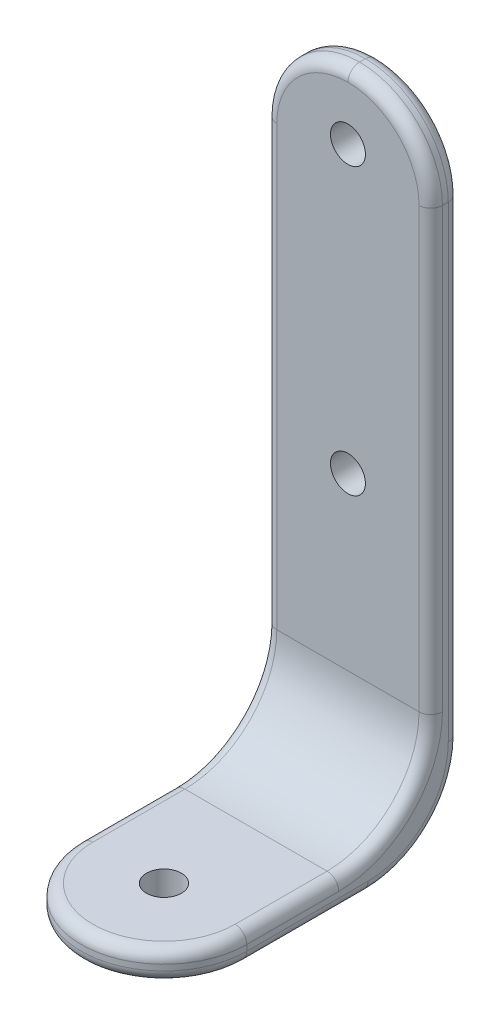
ISO-10303-21;
HEADER;
FILE_DESCRIPTION(('STEP AP214'),'2;1');
FILE_NAME('part.step','',(''),(''),'','','');
FILE_SCHEMA(('AUTOMOTIVE_DESIGN { 1 0 10303 214 1 1 1 1 }'));
ENDSEC;
DATA;
#1=APPLICATION_CONTEXT('core data for automotive mechanical design processes');
#2=APPLICATION_PROTOCOL_DEFINITION('international standard','automotive_design',2000,#1);
#3=PRODUCT_CONTEXT('',#1,'mechanical');
#4=PRODUCT('Part','Part','',(#3));
#5=PRODUCT_RELATED_PRODUCT_CATEGORY('part','',(#4));
#6=PRODUCT_DEFINITION_FORMATION('','',#4);
#7=PRODUCT_DEFINITION_CONTEXT('part definition',#1,'design');
#8=PRODUCT_DEFINITION('design','',#6,#7);
#9=PRODUCT_DEFINITION_SHAPE('','',#8);
#10=(LENGTH_UNIT() NAMED_UNIT(*) SI_UNIT(.MILLI.,.METRE.));
#11=(NAMED_UNIT(*) PLANE_ANGLE_UNIT() SI_UNIT($,.RADIAN.));
#12=(NAMED_UNIT(*) SI_UNIT($,.STERADIAN.) SOLID_ANGLE_UNIT());
#13=UNCERTAINTY_MEASURE_WITH_UNIT(LENGTH_MEASURE(1.E-05),#10,'distance_accuracy_value','');
#14=(GEOMETRIC_REPRESENTATION_CONTEXT(3) GLOBAL_UNCERTAINTY_ASSIGNED_CONTEXT((#13)) GLOBAL_UNIT_ASSIGNED_CONTEXT((#10,
#11,#12)) REPRESENTATION_CONTEXT('',''));
#15=CARTESIAN_POINT('',(0.,0.,0.));
#16=DIRECTION('',(0.,0.,1.));
#17=DIRECTION('',(1.,0.,0.));
#18=AXIS2_PLACEMENT_3D('',#15,#16,#17);
#19=CARTESIAN_POINT('',(-9.,-3.175,-7.08750000000001));
#20=DIRECTION('',(1.,0.,0.));
#21=DIRECTION('',(0.,0.,-1.));
#22=AXIS2_PLACEMENT_3D('',#19,#20,#21);
#23=PLANE('',#22);
#24=CARTESIAN_POINT('',(-9.,6.825,-13.175));
#25=DIRECTION('',(1.,0.,0.));
#26=DIRECTION('',(0.,0.,-1.));
#27=AXIS2_PLACEMENT_3D('',#24,#25,#26);
#28=CIRCLE('',#27,8.73);
#29=CARTESIAN_POINT('',(-9.,6.825,-21.905));
#30=VERTEX_POINT('',#29);
#31=CARTESIAN_POINT('',(-9.,-1.905,-13.175));
#32=VERTEX_POINT('',#31);
#33=EDGE_CURVE('E277',#30,#32,#28,.F.);
#34=ORIENTED_EDGE('',*,*,#33,.T.);
#35=DIRECTION('',(0.,0.,-1.));
#36=VECTOR('',#35,1.);
#37=CARTESIAN_POINT('',(-9.,-1.905,-7.08750000000001));
#38=LINE('',#37,#36);
#39=CARTESIAN_POINT('',(-9.,-1.905,0.));
#40=VERTEX_POINT('',#39);
#41=EDGE_CURVE('E275',#32,#40,#38,.F.);
#42=ORIENTED_EDGE('',*,*,#41,.T.);
#43=DIRECTION('',(0.,1.,0.));
#44=VECTOR('',#43,1.);
#45=CARTESIAN_POINT('',(-9.,-3.175,0.));
#46=LINE('',#45,#44);
#47=CARTESIAN_POINT('',(-9.,-1.27,0.));
#48=VERTEX_POINT('',#47);
#49=EDGE_CURVE('E325',#40,#48,#46,.T.);
#50=ORIENTED_EDGE('',*,*,#49,.T.);
#51=DIRECTION('',(0.,0.,-1.));
#52=VECTOR('',#51,1.);
#53=CARTESIAN_POINT('',(-9.,-1.27,-10.));
#54=LINE('',#53,#52);
#55=CARTESIAN_POINT('',(-9.,-1.27,-10.));
#56=VERTEX_POINT('',#55);
#57=EDGE_CURVE('E285',#48,#56,#54,.T.);
#58=ORIENTED_EDGE('',*,*,#57,.T.);
#59=CARTESIAN_POINT('',(-9.,10.,-10.));
#60=DIRECTION('',(1.,0.,0.));
#61=DIRECTION('',(0.,0.,-1.));
#62=AXIS2_PLACEMENT_3D('',#59,#60,#61);
#63=CIRCLE('',#62,11.27);
#64=CARTESIAN_POINT('',(-9.,10.,-21.27));
#65=VERTEX_POINT('',#64);
#66=EDGE_CURVE('E283',#56,#65,#63,.T.);
#67=ORIENTED_EDGE('',*,*,#66,.T.);
#68=DIRECTION('',(0.,-1.,0.));
#69=VECTOR('',#68,1.);
#70=CARTESIAN_POINT('',(-9.,-3.175,-21.27));
#71=LINE('',#70,#69);
#72=CARTESIAN_POINT('',(-9.,57.675,-21.27));
#73=VERTEX_POINT('',#72);
#74=EDGE_CURVE('E281',#65,#73,#71,.F.);
#75=ORIENTED_EDGE('',*,*,#74,.T.);
#76=DIRECTION('',(0.,0.,-1.));
#77=VECTOR('',#76,1.);
#78=CARTESIAN_POINT('',(-9.,57.675,-23.175));
#79=LINE('',#78,#77);
#80=CARTESIAN_POINT('',(-9.,57.675,-21.905));
#81=VERTEX_POINT('',#80);
#82=EDGE_CURVE('E180',#73,#81,#79,.T.);
#83=ORIENTED_EDGE('',*,*,#82,.T.);
#84=DIRECTION('',(0.,1.,0.));
#85=VECTOR('',#84,1.);
#86=CARTESIAN_POINT('',(-9.,-3.175,-21.905));
#87=LINE('',#86,#85);
#88=EDGE_CURVE('E279',#81,#30,#87,.F.);
#89=ORIENTED_EDGE('',*,*,#88,.T.);
#90=EDGE_LOOP('',(#34,#42,#50,#58,#67,#75,#83,#89));
#91=FACE_BOUND('',#90,.T.);
#92=ADVANCED_FACE('F34',(#91),#23,.F.);
#93=CARTESIAN_POINT('',(-28.8177971405829,-3.175,-23.175));
#94=DIRECTION('',(0.,0.,1.));
#95=DIRECTION('',(1.,0.,0.));
#96=AXIS2_PLACEMENT_3D('',#93,#94,#95);
#97=PLANE('',#96);
#98=CARTESIAN_POINT('',(0.,59.575,-23.175));
#99=DIRECTION('',(0.,0.,1.));
#100=DIRECTION('',(1.,0.,0.));
#101=AXIS2_PLACEMENT_3D('',#98,#99,#100);
#102=CIRCLE('',#101,1.89865);
#103=CARTESIAN_POINT('',(1.89865,59.575,-23.175));
#104=VERTEX_POINT('',#103);
#105=EDGE_CURVE('E342',#104,#104,#102,.T.);
#106=ORIENTED_EDGE('',*,*,#105,.T.);
#107=EDGE_LOOP('',(#106));
#108=FACE_BOUND('',#107,.T.);
#109=CARTESIAN_POINT('',(0.,28.575,-23.175));
#110=DIRECTION('',(0.,0.,1.));
#111=DIRECTION('',(1.,0.,0.));
#112=AXIS2_PLACEMENT_3D('',#109,#110,#111);
#113=CIRCLE('',#112,1.89865);
#114=CARTESIAN_POINT('',(1.89865,28.575,-23.175));
#115=VERTEX_POINT('',#114);
#116=EDGE_CURVE('E336',#115,#115,#113,.T.);
#117=ORIENTED_EDGE('',*,*,#116,.T.);
#118=EDGE_LOOP('',(#117));
#119=FACE_BOUND('',#118,.T.);
#120=DIRECTION('',(1.,0.,0.));
#121=VECTOR('',#120,1.);
#122=CARTESIAN_POINT('',(-28.8177971405829,6.825,-23.175));
#123=LINE('',#122,#121);
#124=CARTESIAN_POINT('',(7.73,6.825,-23.175));
#125=VERTEX_POINT('',#124);
#126=CARTESIAN_POINT('',(-7.73,6.825,-23.175));
#127=VERTEX_POINT('',#126);
#128=EDGE_CURVE('E310',#125,#127,#123,.F.);
#129=ORIENTED_EDGE('',*,*,#128,.T.);
#130=DIRECTION('',(0.,1.,0.));
#131=VECTOR('',#130,1.);
#132=CARTESIAN_POINT('',(-7.73,-3.175,-23.175));
#133=LINE('',#132,#131);
#134=CARTESIAN_POINT('',(-7.73,57.675,-23.175));
#135=VERTEX_POINT('',#134);
#136=EDGE_CURVE('E268',#127,#135,#133,.T.);
#137=ORIENTED_EDGE('',*,*,#136,.T.);
#138=CARTESIAN_POINT('',(0.,57.675,-23.175));
#139=DIRECTION('',(0.,0.,1.));
#140=DIRECTION('',(1.,0.,0.));
#141=AXIS2_PLACEMENT_3D('',#138,#139,#140);
#142=CIRCLE('',#141,7.73);
#143=CARTESIAN_POINT('',(0.,65.405,-23.175));
#144=VERTEX_POINT('',#143);
#145=EDGE_CURVE('E270',#135,#144,#142,.F.);
#146=ORIENTED_EDGE('',*,*,#145,.T.);
#147=CARTESIAN_POINT('',(0.,57.675,-23.175));
#148=DIRECTION('',(0.,0.,1.));
#149=DIRECTION('',(1.,0.,0.));
#150=AXIS2_PLACEMENT_3D('',#147,#148,#149);
#151=CIRCLE('',#150,7.73);
#152=CARTESIAN_POINT('',(7.73,57.675,-23.175));
#153=VERTEX_POINT('',#152);
#154=EDGE_CURVE('E272',#144,#153,#151,.F.);
#155=ORIENTED_EDGE('',*,*,#154,.T.);
#156=DIRECTION('',(0.,1.,0.));
#157=VECTOR('',#156,1.);
#158=CARTESIAN_POINT('',(7.73,6.825,-23.175));
#159=LINE('',#158,#157);
#160=EDGE_CURVE('E194',#153,#125,#159,.F.);
#161=ORIENTED_EDGE('',*,*,#160,.T.);
#162=EDGE_LOOP('',(#129,#137,#146,#155,#161));
#163=FACE_BOUND('',#162,.T.);
#164=ADVANCED_FACE('F423',(#108,#119,#163),#97,.F.);
#165=CARTESIAN_POINT('',(9.,-3.175,-7.08750000000001));
#166=DIRECTION('',(1.,0.,0.));
#167=DIRECTION('',(0.,0.,-1.));
#168=AXIS2_PLACEMENT_3D('',#165,#166,#167);
#169=PLANE('',#168);
#170=DIRECTION('',(0.,1.,0.));
#171=VECTOR('',#170,1.);
#172=CARTESIAN_POINT('',(9.,-3.175,0.));
#173=LINE('',#172,#171);
#174=CARTESIAN_POINT('',(9.,-1.905,0.));
#175=VERTEX_POINT('',#174);
#176=CARTESIAN_POINT('',(9.,-1.27,0.));
#177=VERTEX_POINT('',#176);
#178=EDGE_CURVE('E324',#175,#177,#173,.T.);
#179=ORIENTED_EDGE('',*,*,#178,.F.);
#180=DIRECTION('',(0.,0.,-1.));
#181=VECTOR('',#180,1.);
#182=CARTESIAN_POINT('',(9.,-1.905,-13.175));
#183=LINE('',#182,#181);
#184=CARTESIAN_POINT('',(9.,-1.905,-13.175));
#185=VERTEX_POINT('',#184);
#186=EDGE_CURVE('E302',#175,#185,#183,.T.);
#187=ORIENTED_EDGE('',*,*,#186,.T.);
#188=CARTESIAN_POINT('',(9.,6.825,-13.175));
#189=DIRECTION('',(1.,0.,0.));
#190=DIRECTION('',(0.,0.,-1.));
#191=AXIS2_PLACEMENT_3D('',#188,#189,#190);
#192=CIRCLE('',#191,8.73);
#193=CARTESIAN_POINT('',(9.,6.825,-21.905));
#194=VERTEX_POINT('',#193);
#195=EDGE_CURVE('E164',#185,#194,#192,.T.);
#196=ORIENTED_EDGE('',*,*,#195,.T.);
#197=DIRECTION('',(0.,1.,0.));
#198=VECTOR('',#197,1.);
#199=CARTESIAN_POINT('',(9.,57.675,-21.905));
#200=LINE('',#199,#198);
#201=CARTESIAN_POINT('',(9.,57.675,-21.905));
#202=VERTEX_POINT('',#201);
#203=EDGE_CURVE('E158',#194,#202,#200,.T.);
#204=ORIENTED_EDGE('',*,*,#203,.T.);
#205=DIRECTION('',(0.,0.,1.));
#206=VECTOR('',#205,1.);
#207=CARTESIAN_POINT('',(9.,57.675,-7.08750000000001));
#208=LINE('',#207,#206);
#209=CARTESIAN_POINT('',(9.,57.675,-21.27));
#210=VERTEX_POINT('',#209);
#211=EDGE_CURVE('E162',#202,#210,#208,.T.);
#212=ORIENTED_EDGE('',*,*,#211,.T.);
#213=DIRECTION('',(0.,-1.,0.));
#214=VECTOR('',#213,1.);
#215=CARTESIAN_POINT('',(9.,10.,-21.27));
#216=LINE('',#215,#214);
#217=CARTESIAN_POINT('',(9.,10.,-21.27));
#218=VERTEX_POINT('',#217);
#219=EDGE_CURVE('E308',#210,#218,#216,.T.);
#220=ORIENTED_EDGE('',*,*,#219,.T.);
#221=CARTESIAN_POINT('',(9.,10.,-10.));
#222=DIRECTION('',(1.,0.,0.));
#223=DIRECTION('',(0.,0.,-1.));
#224=AXIS2_PLACEMENT_3D('',#221,#222,#223);
#225=CIRCLE('',#224,11.27);
#226=CARTESIAN_POINT('',(9.,-1.27,-10.));
#227=VERTEX_POINT('',#226);
#228=EDGE_CURVE('E306',#218,#227,#225,.F.);
#229=ORIENTED_EDGE('',*,*,#228,.T.);
#230=DIRECTION('',(0.,0.,-1.));
#231=VECTOR('',#230,1.);
#232=CARTESIAN_POINT('',(9.,-1.27,-7.08750000000001));
#233=LINE('',#232,#231);
#234=EDGE_CURVE('E168',#227,#177,#233,.F.);
#235=ORIENTED_EDGE('',*,*,#234,.T.);
#236=EDGE_LOOP('',(#179,#187,#196,#204,#212,#220,#229,#235));
#237=FACE_BOUND('',#236,.T.);
#238=ADVANCED_FACE('F161',(#237),#169,.T.);
#239=CARTESIAN_POINT('',(0.,-3.175,0.));
#240=DIRECTION('',(0.,1.,0.));
#241=DIRECTION('',(0.,0.,1.));
#242=AXIS2_PLACEMENT_3D('',#239,#240,#241);
#243=CYLINDRICAL_SURFACE('',#242,9.);
#244=ORIENTED_EDGE('',*,*,#49,.F.);
#245=CARTESIAN_POINT('',(0.,-1.905,0.));
#246=DIRECTION('',(0.,1.,0.));
#247=DIRECTION('',(0.,0.,1.));
#248=AXIS2_PLACEMENT_3D('',#245,#246,#247);
#249=CIRCLE('',#248,9.);
#250=EDGE_CURVE('E287',#40,#175,#249,.T.);
#251=ORIENTED_EDGE('',*,*,#250,.T.);
#252=ORIENTED_EDGE('',*,*,#178,.T.);
#253=CARTESIAN_POINT('',(0.,-1.27,0.));
#254=DIRECTION('',(0.,1.,0.));
#255=DIRECTION('',(0.,0.,1.));
#256=AXIS2_PLACEMENT_3D('',#253,#254,#255);
#257=CIRCLE('',#256,9.);
#258=EDGE_CURVE('E289',#177,#48,#257,.F.);
#259=ORIENTED_EDGE('',*,*,#258,.T.);
#260=EDGE_LOOP('',(#244,#251,#252,#259));
#261=FACE_BOUND('',#260,.T.);
#262=ADVANCED_FACE('F393',(#261),#243,.T.);
#263=CARTESIAN_POINT('',(-28.8177971405829,-3.175,-7.08750000000001));
#264=DIRECTION('',(0.,1.,0.));
#265=DIRECTION('',(0.,0.,1.));
#266=AXIS2_PLACEMENT_3D('',#263,#264,#265);
#267=PLANE('',#266);
#268=CARTESIAN_POINT('',(0.,-3.175,0.));
#269=DIRECTION('',(0.,1.,0.));
#270=DIRECTION('',(0.,0.,1.));
#271=AXIS2_PLACEMENT_3D('',#268,#269,#270);
#272=CIRCLE('',#271,1.89865);
#273=CARTESIAN_POINT('',(0.,-3.175,1.89865));
#274=VERTEX_POINT('',#273);
#275=EDGE_CURVE('E328',#274,#274,#272,.T.);
#276=ORIENTED_EDGE('',*,*,#275,.T.);
#277=EDGE_LOOP('',(#276));
#278=FACE_BOUND('',#277,.T.);
#279=DIRECTION('',(1.,0.,0.));
#280=VECTOR('',#279,1.);
#281=CARTESIAN_POINT('',(-28.8177971405829,-3.175,-13.175));
#282=LINE('',#281,#280);
#283=CARTESIAN_POINT('',(-7.73,-3.175,-13.175));
#284=VERTEX_POINT('',#283);
#285=CARTESIAN_POINT('',(7.73,-3.175,-13.175));
#286=VERTEX_POINT('',#285);
#287=EDGE_CURVE('E179',#284,#286,#282,.T.);
#288=ORIENTED_EDGE('',*,*,#287,.T.);
#289=DIRECTION('',(0.,0.,-1.));
#290=VECTOR('',#289,1.);
#291=CARTESIAN_POINT('',(7.73,-3.175,0.));
#292=LINE('',#291,#290);
#293=CARTESIAN_POINT('',(7.73,-3.175,0.));
#294=VERTEX_POINT('',#293);
#295=EDGE_CURVE('E291',#286,#294,#292,.F.);
#296=ORIENTED_EDGE('',*,*,#295,.T.);
#297=CARTESIAN_POINT('',(0.,-3.175,0.));
#298=DIRECTION('',(0.,1.,0.));
#299=DIRECTION('',(0.,0.,1.));
#300=AXIS2_PLACEMENT_3D('',#297,#298,#299);
#301=CIRCLE('',#300,7.73);
#302=CARTESIAN_POINT('',(-7.73,-3.175,0.));
#303=VERTEX_POINT('',#302);
#304=EDGE_CURVE('E293',#294,#303,#301,.F.);
#305=ORIENTED_EDGE('',*,*,#304,.T.);
#306=DIRECTION('',(0.,0.,-1.));
#307=VECTOR('',#306,1.);
#308=CARTESIAN_POINT('',(-7.73,-3.175,-7.08750000000001));
#309=LINE('',#308,#307);
#310=EDGE_CURVE('E295',#303,#284,#309,.T.);
#311=ORIENTED_EDGE('',*,*,#310,.T.);
#312=EDGE_LOOP('',(#288,#296,#305,#311));
#313=FACE_BOUND('',#312,.T.);
#314=ADVANCED_FACE('F675',(#278,#313),#267,.F.);
#315=CARTESIAN_POINT('',(-28.8177971405829,0.,-7.08750000000001));
#316=DIRECTION('',(0.,1.,0.));
#317=DIRECTION('',(0.,0.,1.));
#318=AXIS2_PLACEMENT_3D('',#315,#316,#317);
#319=PLANE('',#318);
#320=CARTESIAN_POINT('',(0.,0.,0.));
#321=DIRECTION('',(0.,1.,0.));
#322=DIRECTION('',(0.,0.,1.));
#323=AXIS2_PLACEMENT_3D('',#320,#321,#322);
#324=CIRCLE('',#323,1.89865);
#325=CARTESIAN_POINT('',(0.,0.,1.89865));
#326=VERTEX_POINT('',#325);
#327=EDGE_CURVE('E333',#326,#326,#324,.T.);
#328=ORIENTED_EDGE('',*,*,#327,.F.);
#329=EDGE_LOOP('',(#328));
#330=FACE_BOUND('',#329,.T.);
#331=DIRECTION('',(1.,0.,0.));
#332=VECTOR('',#331,1.);
#333=CARTESIAN_POINT('',(-28.8177971405829,0.,-10.));
#334=LINE('',#333,#332);
#335=CARTESIAN_POINT('',(7.73,0.,-10.));
#336=VERTEX_POINT('',#335);
#337=CARTESIAN_POINT('',(-7.73,0.,-10.));
#338=VERTEX_POINT('',#337);
#339=EDGE_CURVE('E319',#336,#338,#334,.F.);
#340=ORIENTED_EDGE('',*,*,#339,.T.);
#341=DIRECTION('',(0.,0.,-1.));
#342=VECTOR('',#341,1.);
#343=CARTESIAN_POINT('',(-7.73,0.,0.));
#344=LINE('',#343,#342);
#345=CARTESIAN_POINT('',(-7.73,0.,0.));
#346=VERTEX_POINT('',#345);
#347=EDGE_CURVE('E11',#338,#346,#344,.F.);
#348=ORIENTED_EDGE('',*,*,#347,.T.);
#349=CARTESIAN_POINT('',(0.,0.,0.));
#350=DIRECTION('',(0.,1.,0.));
#351=DIRECTION('',(0.,0.,1.));
#352=AXIS2_PLACEMENT_3D('',#349,#350,#351);
#353=CIRCLE('',#352,7.73);
#354=CARTESIAN_POINT('',(7.73,0.,0.));
#355=VERTEX_POINT('',#354);
#356=EDGE_CURVE('E43',#346,#355,#353,.T.);
#357=ORIENTED_EDGE('',*,*,#356,.T.);
#358=DIRECTION('',(0.,0.,-1.));
#359=VECTOR('',#358,1.);
#360=CARTESIAN_POINT('',(7.73,0.,-7.08750000000001));
#361=LINE('',#360,#359);
#362=EDGE_CURVE('E249',#355,#336,#361,.T.);
#363=ORIENTED_EDGE('',*,*,#362,.T.);
#364=EDGE_LOOP('',(#340,#348,#357,#363));
#365=FACE_BOUND('',#364,.T.);
#366=ADVANCED_FACE('F354',(#330,#365),#319,.T.);
#367=CARTESIAN_POINT('',(-28.8177971405829,66.675,-20.));
#368=DIRECTION('',(0.,0.,-1.));
#369=DIRECTION('',(-1.,0.,0.));
#370=AXIS2_PLACEMENT_3D('',#367,#368,#369);
#371=PLANE('',#370);
#372=CARTESIAN_POINT('',(0.,59.575,-20.));
#373=DIRECTION('',(0.,0.,1.));
#374=DIRECTION('',(1.,0.,0.));
#375=AXIS2_PLACEMENT_3D('',#372,#373,#374);
#376=CIRCLE('',#375,1.89865);
#377=CARTESIAN_POINT('',(1.89865,59.575,-20.));
#378=VERTEX_POINT('',#377);
#379=EDGE_CURVE('E315',#378,#378,#376,.T.);
#380=ORIENTED_EDGE('',*,*,#379,.F.);
#381=EDGE_LOOP('',(#380));
#382=FACE_BOUND('',#381,.T.);
#383=CARTESIAN_POINT('',(0.,28.575,-20.));
#384=DIRECTION('',(0.,0.,1.));
#385=DIRECTION('',(1.,0.,0.));
#386=AXIS2_PLACEMENT_3D('',#383,#384,#385);
#387=CIRCLE('',#386,1.89865);
#388=CARTESIAN_POINT('',(1.89865,28.575,-20.));
#389=VERTEX_POINT('',#388);
#390=EDGE_CURVE('E339',#389,#389,#387,.T.);
#391=ORIENTED_EDGE('',*,*,#390,.F.);
#392=EDGE_LOOP('',(#391));
#393=FACE_BOUND('',#392,.T.);
#394=CARTESIAN_POINT('',(0.,57.675,-20.));
#395=DIRECTION('',(0.,0.,-1.));
#396=DIRECTION('',(-1.,0.,0.));
#397=AXIS2_PLACEMENT_3D('',#394,#395,#396);
#398=CIRCLE('',#397,7.73);
#399=CARTESIAN_POINT('',(0.,65.405,-20.));
#400=VERTEX_POINT('',#399);
#401=CARTESIAN_POINT('',(-7.73,57.675,-20.));
#402=VERTEX_POINT('',#401);
#403=EDGE_CURVE('E257',#400,#402,#398,.F.);
#404=ORIENTED_EDGE('',*,*,#403,.T.);
#405=DIRECTION('',(0.,-1.,0.));
#406=VECTOR('',#405,1.);
#407=CARTESIAN_POINT('',(-7.73,66.675,-20.));
#408=LINE('',#407,#406);
#409=CARTESIAN_POINT('',(-7.73,10.,-20.));
#410=VERTEX_POINT('',#409);
#411=EDGE_CURVE('E255',#402,#410,#408,.T.);
#412=ORIENTED_EDGE('',*,*,#411,.T.);
#413=DIRECTION('',(1.,0.,0.));
#414=VECTOR('',#413,1.);
#415=CARTESIAN_POINT('',(-28.8177971405829,10.,-20.));
#416=LINE('',#415,#414);
#417=CARTESIAN_POINT('',(7.73,10.,-20.));
#418=VERTEX_POINT('',#417);
#419=EDGE_CURVE('E321',#410,#418,#416,.T.);
#420=ORIENTED_EDGE('',*,*,#419,.T.);
#421=DIRECTION('',(0.,-1.,0.));
#422=VECTOR('',#421,1.);
#423=CARTESIAN_POINT('',(7.73,57.675,-20.));
#424=LINE('',#423,#422);
#425=CARTESIAN_POINT('',(7.73,57.675,-20.));
#426=VERTEX_POINT('',#425);
#427=EDGE_CURVE('E191',#418,#426,#424,.F.);
#428=ORIENTED_EDGE('',*,*,#427,.T.);
#429=CARTESIAN_POINT('',(0.,57.675,-20.));
#430=DIRECTION('',(0.,0.,-1.));
#431=DIRECTION('',(-1.,0.,0.));
#432=AXIS2_PLACEMENT_3D('',#429,#430,#431);
#433=CIRCLE('',#432,7.73);
#434=EDGE_CURVE('E259',#426,#400,#433,.F.);
#435=ORIENTED_EDGE('',*,*,#434,.T.);
#436=EDGE_LOOP('',(#404,#412,#420,#428,#435));
#437=FACE_BOUND('',#436,.T.);
#438=ADVANCED_FACE('F350',(#382,#393,#437),#371,.F.);
#439=CARTESIAN_POINT('',(0.,0.,0.));
#440=DIRECTION('',(0.,1.,0.));
#441=DIRECTION('',(0.,0.,1.));
#442=AXIS2_PLACEMENT_3D('',#439,#440,#441);
#443=CYLINDRICAL_SURFACE('',#442,1.89865);
#444=ORIENTED_EDGE('',*,*,#275,.F.);
#445=EDGE_LOOP('',(#444));
#446=FACE_BOUND('',#445,.T.);
#447=ORIENTED_EDGE('',*,*,#327,.T.);
#448=EDGE_LOOP('',(#447));
#449=FACE_BOUND('',#448,.T.);
#450=ADVANCED_FACE('F353',(#446,#449),#443,.F.);
#451=CARTESIAN_POINT('',(0.,28.575,-20.));
#452=DIRECTION('',(0.,0.,1.));
#453=DIRECTION('',(1.,0.,0.));
#454=AXIS2_PLACEMENT_3D('',#451,#452,#453);
#455=CYLINDRICAL_SURFACE('',#454,1.89865);
#456=ORIENTED_EDGE('',*,*,#116,.F.);
#457=EDGE_LOOP('',(#456));
#458=FACE_BOUND('',#457,.T.);
#459=ORIENTED_EDGE('',*,*,#390,.T.);
#460=EDGE_LOOP('',(#459));
#461=FACE_BOUND('',#460,.T.);
#462=ADVANCED_FACE('F618',(#458,#461),#455,.F.);
#463=CARTESIAN_POINT('',(0.,59.575,-20.));
#464=DIRECTION('',(0.,0.,1.));
#465=DIRECTION('',(1.,0.,0.));
#466=AXIS2_PLACEMENT_3D('',#463,#464,#465);
#467=CYLINDRICAL_SURFACE('',#466,1.89865);
#468=ORIENTED_EDGE('',*,*,#105,.F.);
#469=EDGE_LOOP('',(#468));
#470=FACE_BOUND('',#469,.T.);
#471=ORIENTED_EDGE('',*,*,#379,.T.);
#472=EDGE_LOOP('',(#471));
#473=FACE_BOUND('',#472,.T.);
#474=ADVANCED_FACE('F348',(#470,#473),#467,.F.);
#475=CARTESIAN_POINT('',(-28.8177971405829,10.,-10.));
#476=DIRECTION('',(1.,0.,0.));
#477=DIRECTION('',(0.,0.,-1.));
#478=AXIS2_PLACEMENT_3D('',#475,#476,#477);
#479=CYLINDRICAL_SURFACE('',#478,10.);
#480=ORIENTED_EDGE('',*,*,#419,.F.);
#481=CARTESIAN_POINT('',(-7.73,10.,-10.));
#482=DIRECTION('',(1.,0.,0.));
#483=DIRECTION('',(0.,0.,-1.));
#484=AXIS2_PLACEMENT_3D('',#481,#482,#483);
#485=CIRCLE('',#484,10.);
#486=EDGE_CURVE('E251',#410,#338,#485,.F.);
#487=ORIENTED_EDGE('',*,*,#486,.T.);
#488=ORIENTED_EDGE('',*,*,#339,.F.);
#489=CARTESIAN_POINT('',(7.73,10.,-10.));
#490=DIRECTION('',(1.,0.,0.));
#491=DIRECTION('',(0.,0.,-1.));
#492=AXIS2_PLACEMENT_3D('',#489,#490,#491);
#493=CIRCLE('',#492,10.);
#494=EDGE_CURVE('E253',#336,#418,#493,.T.);
#495=ORIENTED_EDGE('',*,*,#494,.T.);
#496=EDGE_LOOP('',(#480,#487,#488,#495));
#497=FACE_BOUND('',#496,.T.);
#498=ADVANCED_FACE('F433',(#497),#479,.F.);
#499=CARTESIAN_POINT('',(0.,57.675,-7.08750000000001));
#500=DIRECTION('',(0.,0.,1.));
#501=DIRECTION('',(1.,0.,0.));
#502=AXIS2_PLACEMENT_3D('',#499,#500,#501);
#503=CYLINDRICAL_SURFACE('',#502,9.);
#504=ORIENTED_EDGE('',*,*,#211,.F.);
#505=CARTESIAN_POINT('',(0.,57.675,-21.905));
#506=DIRECTION('',(0.,0.,1.));
#507=DIRECTION('',(1.,0.,0.));
#508=AXIS2_PLACEMENT_3D('',#505,#506,#507);
#509=CIRCLE('',#508,9.);
#510=CARTESIAN_POINT('',(0.,66.675,-21.905));
#511=VERTEX_POINT('',#510);
#512=EDGE_CURVE('E175',#202,#511,#509,.T.);
#513=ORIENTED_EDGE('',*,*,#512,.T.);
#514=DIRECTION('',(0.,0.,1.));
#515=VECTOR('',#514,1.);
#516=CARTESIAN_POINT('',(0.,66.675,-7.08750000000001));
#517=LINE('',#516,#515);
#518=CARTESIAN_POINT('',(0.,66.675,-21.27));
#519=VERTEX_POINT('',#518);
#520=EDGE_CURVE('E217',#519,#511,#517,.F.);
#521=ORIENTED_EDGE('',*,*,#520,.F.);
#522=CARTESIAN_POINT('',(0.,57.675,-21.27));
#523=DIRECTION('',(0.,0.,-1.));
#524=DIRECTION('',(-1.,0.,0.));
#525=AXIS2_PLACEMENT_3D('',#522,#523,#524);
#526=CIRCLE('',#525,9.);
#527=EDGE_CURVE('E178',#519,#210,#526,.T.);
#528=ORIENTED_EDGE('',*,*,#527,.T.);
#529=EDGE_LOOP('',(#504,#513,#521,#528));
#530=FACE_BOUND('',#529,.T.);
#531=ADVANCED_FACE('F173',(#530),#503,.T.);
#532=CARTESIAN_POINT('',(0.,57.675,-7.08750000000001));
#533=DIRECTION('',(0.,0.,1.));
#534=DIRECTION('',(1.,0.,0.));
#535=AXIS2_PLACEMENT_3D('',#532,#533,#534);
#536=CYLINDRICAL_SURFACE('',#535,9.);
#537=ORIENTED_EDGE('',*,*,#520,.T.);
#538=CARTESIAN_POINT('',(0.,57.675,-21.905));
#539=DIRECTION('',(0.,0.,1.));
#540=DIRECTION('',(1.,0.,0.));
#541=AXIS2_PLACEMENT_3D('',#538,#539,#540);
#542=CIRCLE('',#541,9.);
#543=EDGE_CURVE('E264',#511,#81,#542,.T.);
#544=ORIENTED_EDGE('',*,*,#543,.T.);
#545=ORIENTED_EDGE('',*,*,#82,.F.);
#546=CARTESIAN_POINT('',(0.,57.675,-21.27));
#547=DIRECTION('',(0.,0.,-1.));
#548=DIRECTION('',(-1.,0.,0.));
#549=AXIS2_PLACEMENT_3D('',#546,#547,#548);
#550=CIRCLE('',#549,9.);
#551=EDGE_CURVE('E266',#73,#519,#550,.T.);
#552=ORIENTED_EDGE('',*,*,#551,.T.);
#553=EDGE_LOOP('',(#537,#544,#545,#552));
#554=FACE_BOUND('',#553,.T.);
#555=ADVANCED_FACE('F373',(#554),#536,.T.);
#556=CARTESIAN_POINT('',(-28.8177971405829,6.825,-13.175));
#557=DIRECTION('',(1.,0.,0.));
#558=DIRECTION('',(0.,0.,-1.));
#559=AXIS2_PLACEMENT_3D('',#556,#557,#558);
#560=CYLINDRICAL_SURFACE('',#559,10.);
#561=ORIENTED_EDGE('',*,*,#128,.F.);
#562=CARTESIAN_POINT('',(7.73,6.825,-13.175));
#563=DIRECTION('',(1.,0.,0.));
#564=DIRECTION('',(0.,0.,-1.));
#565=AXIS2_PLACEMENT_3D('',#562,#563,#564);
#566=CIRCLE('',#565,10.);
#567=EDGE_CURVE('E297',#125,#286,#566,.F.);
#568=ORIENTED_EDGE('',*,*,#567,.T.);
#569=ORIENTED_EDGE('',*,*,#287,.F.);
#570=CARTESIAN_POINT('',(-7.73,6.825,-13.175));
#571=DIRECTION('',(1.,0.,0.));
#572=DIRECTION('',(0.,0.,-1.));
#573=AXIS2_PLACEMENT_3D('',#570,#571,#572);
#574=CIRCLE('',#573,10.);
#575=EDGE_CURVE('E300',#284,#127,#574,.T.);
#576=ORIENTED_EDGE('',*,*,#575,.T.);
#577=EDGE_LOOP('',(#561,#568,#569,#576));
#578=FACE_BOUND('',#577,.T.);
#579=ADVANCED_FACE('F439',(#578),#560,.T.);
#580=CARTESIAN_POINT('',(-7.73,6.825,-13.175));
#581=DIRECTION('',(1.,0.,0.));
#582=DIRECTION('',(0.,0.,-1.));
#583=AXIS2_PLACEMENT_3D('',#580,#581,#582);
#584=TOROIDAL_SURFACE('',#583,8.73,1.27);
#585=CARTESIAN_POINT('',(-7.73,-1.905,-13.175));
#586=DIRECTION('',(0.,0.,1.));
#587=DIRECTION('',(1.,0.,0.));
#588=AXIS2_PLACEMENT_3D('',#585,#586,#587);
#589=CIRCLE('',#588,1.27);
#590=EDGE_CURVE('E211',#32,#284,#589,.T.);
#591=ORIENTED_EDGE('',*,*,#590,.F.);
#592=ORIENTED_EDGE('',*,*,#33,.F.);
#593=CARTESIAN_POINT('',(-7.73,6.825,-21.905));
#594=DIRECTION('',(0.,1.,0.));
#595=DIRECTION('',(0.,0.,1.));
#596=AXIS2_PLACEMENT_3D('',#593,#594,#595);
#597=CIRCLE('',#596,1.27);
#598=EDGE_CURVE('E214',#127,#30,#597,.T.);
#599=ORIENTED_EDGE('',*,*,#598,.F.);
#600=ORIENTED_EDGE('',*,*,#575,.F.);
#601=EDGE_LOOP('',(#591,#592,#599,#600));
#602=FACE_BOUND('',#601,.T.);
#603=ADVANCED_FACE('F442',(#602),#584,.T.);
#604=CARTESIAN_POINT('',(-7.73,-3.175,-21.905));
#605=DIRECTION('',(0.,1.,0.));
#606=DIRECTION('',(0.,0.,1.));
#607=AXIS2_PLACEMENT_3D('',#604,#605,#606);
#608=CYLINDRICAL_SURFACE('',#607,1.27);
#609=ORIENTED_EDGE('',*,*,#598,.T.);
#610=ORIENTED_EDGE('',*,*,#88,.F.);
#611=CARTESIAN_POINT('',(-7.73,57.675,-21.905));
#612=DIRECTION('',(0.,1.,0.));
#613=DIRECTION('',(0.,0.,1.));
#614=AXIS2_PLACEMENT_3D('',#611,#612,#613);
#615=CIRCLE('',#614,1.27);
#616=EDGE_CURVE('E208',#135,#81,#615,.T.);
#617=ORIENTED_EDGE('',*,*,#616,.F.);
#618=ORIENTED_EDGE('',*,*,#136,.F.);
#619=EDGE_LOOP('',(#609,#610,#617,#618));
#620=FACE_BOUND('',#619,.T.);
#621=ADVANCED_FACE('F447',(#620),#608,.T.);
#622=CARTESIAN_POINT('',(-7.73,-1.905,-7.08750000000001));
#623=DIRECTION('',(0.,0.,-1.));
#624=DIRECTION('',(-1.,0.,0.));
#625=AXIS2_PLACEMENT_3D('',#622,#623,#624);
#626=CYLINDRICAL_SURFACE('',#625,1.27);
#627=ORIENTED_EDGE('',*,*,#590,.T.);
#628=ORIENTED_EDGE('',*,*,#310,.F.);
#629=CARTESIAN_POINT('',(-7.73,-1.905,0.));
#630=DIRECTION('',(0.,0.,1.));
#631=DIRECTION('',(1.,0.,0.));
#632=AXIS2_PLACEMENT_3D('',#629,#630,#631);
#633=CIRCLE('',#632,1.27);
#634=EDGE_CURVE('E205',#40,#303,#633,.T.);
#635=ORIENTED_EDGE('',*,*,#634,.F.);
#636=ORIENTED_EDGE('',*,*,#41,.F.);
#637=EDGE_LOOP('',(#627,#628,#635,#636));
#638=FACE_BOUND('',#637,.T.);
#639=ADVANCED_FACE('F404',(#638),#626,.T.);
#640=CARTESIAN_POINT('',(0.,57.675,-21.905));
#641=DIRECTION('',(0.,0.,1.));
#642=DIRECTION('',(1.,0.,0.));
#643=AXIS2_PLACEMENT_3D('',#640,#641,#642);
#644=TOROIDAL_SURFACE('',#643,7.73,1.27);
#645=ORIENTED_EDGE('',*,*,#616,.T.);
#646=ORIENTED_EDGE('',*,*,#543,.F.);
#647=CARTESIAN_POINT('',(0.,65.405,-21.905));
#648=DIRECTION('',(1.,0.,0.));
#649=DIRECTION('',(0.,1.,0.));
#650=AXIS2_PLACEMENT_3D('',#647,#648,#649);
#651=CIRCLE('',#650,1.27);
#652=EDGE_CURVE('E190',#144,#511,#651,.T.);
#653=ORIENTED_EDGE('',*,*,#652,.F.);
#654=ORIENTED_EDGE('',*,*,#145,.F.);
#655=EDGE_LOOP('',(#645,#646,#653,#654));
#656=FACE_BOUND('',#655,.T.);
#657=ADVANCED_FACE('F463',(#656),#644,.T.);
#658=CARTESIAN_POINT('',(0.,-1.905,0.));
#659=DIRECTION('',(0.,1.,0.));
#660=DIRECTION('',(0.,0.,1.));
#661=AXIS2_PLACEMENT_3D('',#658,#659,#660);
#662=TOROIDAL_SURFACE('',#661,7.73,1.27);
#663=ORIENTED_EDGE('',*,*,#634,.T.);
#664=ORIENTED_EDGE('',*,*,#304,.F.);
#665=CARTESIAN_POINT('',(7.73,-1.905,0.));
#666=DIRECTION('',(0.,0.,-1.));
#667=DIRECTION('',(-1.,0.,0.));
#668=AXIS2_PLACEMENT_3D('',#665,#666,#667);
#669=CIRCLE('',#668,1.27);
#670=EDGE_CURVE('E195',#175,#294,#669,.T.);
#671=ORIENTED_EDGE('',*,*,#670,.F.);
#672=ORIENTED_EDGE('',*,*,#250,.F.);
#673=EDGE_LOOP('',(#663,#664,#671,#672));
#674=FACE_BOUND('',#673,.T.);
#675=ADVANCED_FACE('F407',(#674),#662,.T.);
#676=CARTESIAN_POINT('',(0.,57.675,-21.905));
#677=DIRECTION('',(0.,0.,1.));
#678=DIRECTION('',(1.,0.,0.));
#679=AXIS2_PLACEMENT_3D('',#676,#677,#678);
#680=TOROIDAL_SURFACE('',#679,7.73,1.27);
#681=ORIENTED_EDGE('',*,*,#652,.T.);
#682=ORIENTED_EDGE('',*,*,#512,.F.);
#683=CARTESIAN_POINT('',(7.73,57.675,-21.905));
#684=DIRECTION('',(0.,-1.,0.));
#685=DIRECTION('',(0.,0.,-1.));
#686=AXIS2_PLACEMENT_3D('',#683,#684,#685);
#687=CIRCLE('',#686,1.27);
#688=EDGE_CURVE('E187',#153,#202,#687,.T.);
#689=ORIENTED_EDGE('',*,*,#688,.F.);
#690=ORIENTED_EDGE('',*,*,#154,.F.);
#691=EDGE_LOOP('',(#681,#682,#689,#690));
#692=FACE_BOUND('',#691,.T.);
#693=ADVANCED_FACE('F185',(#692),#680,.T.);
#694=CARTESIAN_POINT('',(7.73,-1.905,-7.08750000000001));
#695=DIRECTION('',(0.,0.,1.));
#696=DIRECTION('',(1.,0.,0.));
#697=AXIS2_PLACEMENT_3D('',#694,#695,#696);
#698=CYLINDRICAL_SURFACE('',#697,1.27);
#699=ORIENTED_EDGE('',*,*,#670,.T.);
#700=ORIENTED_EDGE('',*,*,#295,.F.);
#701=CARTESIAN_POINT('',(7.73,-1.905,-13.175));
#702=DIRECTION('',(0.,0.,-1.));
#703=DIRECTION('',(-1.,0.,0.));
#704=AXIS2_PLACEMENT_3D('',#701,#702,#703);
#705=CIRCLE('',#704,1.27);
#706=EDGE_CURVE('E196',#185,#286,#705,.T.);
#707=ORIENTED_EDGE('',*,*,#706,.F.);
#708=ORIENTED_EDGE('',*,*,#186,.F.);
#709=EDGE_LOOP('',(#699,#700,#707,#708));
#710=FACE_BOUND('',#709,.T.);
#711=ADVANCED_FACE('F412',(#710),#698,.T.);
#712=CARTESIAN_POINT('',(7.73,-3.175,-21.905));
#713=DIRECTION('',(0.,-1.,0.));
#714=DIRECTION('',(0.,0.,-1.));
#715=AXIS2_PLACEMENT_3D('',#712,#713,#714);
#716=CYLINDRICAL_SURFACE('',#715,1.27);
#717=ORIENTED_EDGE('',*,*,#688,.T.);
#718=ORIENTED_EDGE('',*,*,#203,.F.);
#719=CARTESIAN_POINT('',(7.73,6.825,-21.905));
#720=DIRECTION('',(0.,-1.,0.));
#721=DIRECTION('',(0.,0.,-1.));
#722=AXIS2_PLACEMENT_3D('',#719,#720,#721);
#723=CIRCLE('',#722,1.27);
#724=EDGE_CURVE('E200',#125,#194,#723,.T.);
#725=ORIENTED_EDGE('',*,*,#724,.F.);
#726=ORIENTED_EDGE('',*,*,#160,.F.);
#727=EDGE_LOOP('',(#717,#718,#725,#726));
#728=FACE_BOUND('',#727,.T.);
#729=ADVANCED_FACE('F193',(#728),#716,.T.);
#730=CARTESIAN_POINT('',(7.73,6.825,-13.175));
#731=DIRECTION('',(1.,0.,0.));
#732=DIRECTION('',(0.,0.,-1.));
#733=AXIS2_PLACEMENT_3D('',#730,#731,#732);
#734=TOROIDAL_SURFACE('',#733,8.73,1.27);
#735=ORIENTED_EDGE('',*,*,#706,.T.);
#736=ORIENTED_EDGE('',*,*,#567,.F.);
#737=ORIENTED_EDGE('',*,*,#724,.T.);
#738=ORIENTED_EDGE('',*,*,#195,.F.);
#739=EDGE_LOOP('',(#735,#736,#737,#738));
#740=FACE_BOUND('',#739,.T.);
#741=ADVANCED_FACE('F413',(#740),#734,.T.);
#742=CARTESIAN_POINT('',(0.,-1.27,0.));
#743=DIRECTION('',(0.,1.,0.));
#744=DIRECTION('',(0.,0.,1.));
#745=AXIS2_PLACEMENT_3D('',#742,#743,#744);
#746=TOROIDAL_SURFACE('',#745,7.73,1.27);
#747=CARTESIAN_POINT('',(7.73,-1.27,0.));
#748=DIRECTION('',(0.,0.,-1.));
#749=DIRECTION('',(-1.,0.,0.));
#750=AXIS2_PLACEMENT_3D('',#747,#748,#749);
#751=CIRCLE('',#750,1.27);
#752=EDGE_CURVE('E236',#355,#177,#751,.T.);
#753=ORIENTED_EDGE('',*,*,#752,.F.);
#754=ORIENTED_EDGE('',*,*,#356,.F.);
#755=CARTESIAN_POINT('',(-7.73,-1.27,0.));
#756=DIRECTION('',(0.,0.,-1.));
#757=DIRECTION('',(-1.,0.,0.));
#758=AXIS2_PLACEMENT_3D('',#755,#756,#757);
#759=CIRCLE('',#758,1.27);
#760=EDGE_CURVE('E38',#48,#346,#759,.T.);
#761=ORIENTED_EDGE('',*,*,#760,.F.);
#762=ORIENTED_EDGE('',*,*,#258,.F.);
#763=EDGE_LOOP('',(#753,#754,#761,#762));
#764=FACE_BOUND('',#763,.T.);
#765=ADVANCED_FACE('F36',(#764),#746,.T.);
#766=CARTESIAN_POINT('',(-7.73,-1.27,-7.08750000000001));
#767=DIRECTION('',(0.,0.,1.));
#768=DIRECTION('',(1.,0.,0.));
#769=AXIS2_PLACEMENT_3D('',#766,#767,#768);
#770=CYLINDRICAL_SURFACE('',#769,1.27);
#771=ORIENTED_EDGE('',*,*,#760,.T.);
#772=ORIENTED_EDGE('',*,*,#347,.F.);
#773=CARTESIAN_POINT('',(-7.73,-1.27,-10.));
#774=DIRECTION('',(0.,0.,-1.));
#775=DIRECTION('',(-1.,0.,0.));
#776=AXIS2_PLACEMENT_3D('',#773,#774,#775);
#777=CIRCLE('',#776,1.27);
#778=EDGE_CURVE('E234',#56,#338,#777,.T.);
#779=ORIENTED_EDGE('',*,*,#778,.F.);
#780=ORIENTED_EDGE('',*,*,#57,.F.);
#781=EDGE_LOOP('',(#771,#772,#779,#780));
#782=FACE_BOUND('',#781,.T.);
#783=ADVANCED_FACE('F397',(#782),#770,.T.);
#784=CARTESIAN_POINT('',(7.73,-1.27,-7.08750000000001));
#785=DIRECTION('',(0.,0.,-1.));
#786=DIRECTION('',(-1.,0.,0.));
#787=AXIS2_PLACEMENT_3D('',#784,#785,#786);
#788=CYLINDRICAL_SURFACE('',#787,1.27);
#789=ORIENTED_EDGE('',*,*,#752,.T.);
#790=ORIENTED_EDGE('',*,*,#234,.F.);
#791=CARTESIAN_POINT('',(7.73,-1.27,-10.));
#792=DIRECTION('',(0.,0.,-1.));
#793=DIRECTION('',(-1.,0.,0.));
#794=AXIS2_PLACEMENT_3D('',#791,#792,#793);
#795=CIRCLE('',#794,1.27);
#796=EDGE_CURVE('E231',#336,#227,#795,.T.);
#797=ORIENTED_EDGE('',*,*,#796,.F.);
#798=ORIENTED_EDGE('',*,*,#362,.F.);
#799=EDGE_LOOP('',(#789,#790,#797,#798));
#800=FACE_BOUND('',#799,.T.);
#801=ADVANCED_FACE('F388',(#800),#788,.T.);
#802=CARTESIAN_POINT('',(-7.73,10.,-10.));
#803=DIRECTION('',(1.,0.,0.));
#804=DIRECTION('',(0.,0.,-1.));
#805=AXIS2_PLACEMENT_3D('',#802,#803,#804);
#806=TOROIDAL_SURFACE('',#805,11.27,1.27);
#807=ORIENTED_EDGE('',*,*,#778,.T.);
#808=ORIENTED_EDGE('',*,*,#486,.F.);
#809=CARTESIAN_POINT('',(-7.73,10.,-21.27));
#810=DIRECTION('',(0.,1.,0.));
#811=DIRECTION('',(0.,0.,1.));
#812=AXIS2_PLACEMENT_3D('',#809,#810,#811);
#813=CIRCLE('',#812,1.27);
#814=EDGE_CURVE('E228',#65,#410,#813,.T.);
#815=ORIENTED_EDGE('',*,*,#814,.F.);
#816=ORIENTED_EDGE('',*,*,#66,.F.);
#817=EDGE_LOOP('',(#807,#808,#815,#816));
#818=FACE_BOUND('',#817,.T.);
#819=ADVANCED_FACE('F486',(#818),#806,.T.);
#820=CARTESIAN_POINT('',(7.73,10.,-10.));
#821=DIRECTION('',(1.,0.,0.));
#822=DIRECTION('',(0.,0.,-1.));
#823=AXIS2_PLACEMENT_3D('',#820,#821,#822);
#824=TOROIDAL_SURFACE('',#823,11.27,1.27);
#825=ORIENTED_EDGE('',*,*,#796,.T.);
#826=ORIENTED_EDGE('',*,*,#228,.F.);
#827=CARTESIAN_POINT('',(7.73,10.,-21.27));
#828=DIRECTION('',(0.,1.,0.));
#829=DIRECTION('',(0.,0.,1.));
#830=AXIS2_PLACEMENT_3D('',#827,#828,#829);
#831=CIRCLE('',#830,1.27);
#832=EDGE_CURVE('E225',#418,#218,#831,.T.);
#833=ORIENTED_EDGE('',*,*,#832,.F.);
#834=ORIENTED_EDGE('',*,*,#494,.F.);
#835=EDGE_LOOP('',(#825,#826,#833,#834));
#836=FACE_BOUND('',#835,.T.);
#837=ADVANCED_FACE('F385',(#836),#824,.T.);
#838=CARTESIAN_POINT('',(-7.73,66.675,-21.27));
#839=DIRECTION('',(0.,-1.,0.));
#840=DIRECTION('',(0.,0.,-1.));
#841=AXIS2_PLACEMENT_3D('',#838,#839,#840);
#842=CYLINDRICAL_SURFACE('',#841,1.27);
#843=ORIENTED_EDGE('',*,*,#814,.T.);
#844=ORIENTED_EDGE('',*,*,#411,.F.);
#845=CARTESIAN_POINT('',(-7.73,57.675,-21.27));
#846=DIRECTION('',(0.,1.,0.));
#847=DIRECTION('',(0.,0.,1.));
#848=AXIS2_PLACEMENT_3D('',#845,#846,#847);
#849=CIRCLE('',#848,1.27);
#850=EDGE_CURVE('E222',#73,#402,#849,.T.);
#851=ORIENTED_EDGE('',*,*,#850,.F.);
#852=ORIENTED_EDGE('',*,*,#74,.F.);
#853=EDGE_LOOP('',(#843,#844,#851,#852));
#854=FACE_BOUND('',#853,.T.);
#855=ADVANCED_FACE('F366',(#854),#842,.T.);
#856=CARTESIAN_POINT('',(7.73,-3.175,-21.27));
#857=DIRECTION('',(0.,1.,0.));
#858=DIRECTION('',(0.,0.,1.));
#859=AXIS2_PLACEMENT_3D('',#856,#857,#858);
#860=CYLINDRICAL_SURFACE('',#859,1.27);
#861=ORIENTED_EDGE('',*,*,#832,.T.);
#862=ORIENTED_EDGE('',*,*,#219,.F.);
#863=CARTESIAN_POINT('',(7.73,57.675,-21.27));
#864=DIRECTION('',(0.,1.,0.));
#865=DIRECTION('',(0.,0.,1.));
#866=AXIS2_PLACEMENT_3D('',#863,#864,#865);
#867=CIRCLE('',#866,1.27);
#868=EDGE_CURVE('E220',#426,#210,#867,.T.);
#869=ORIENTED_EDGE('',*,*,#868,.F.);
#870=ORIENTED_EDGE('',*,*,#427,.F.);
#871=EDGE_LOOP('',(#861,#862,#869,#870));
#872=FACE_BOUND('',#871,.T.);
#873=ADVANCED_FACE('F381',(#872),#860,.T.);
#874=CARTESIAN_POINT('',(0.,57.675,-21.27));
#875=DIRECTION('',(0.,0.,-1.));
#876=DIRECTION('',(-1.,0.,0.));
#877=AXIS2_PLACEMENT_3D('',#874,#875,#876);
#878=TOROIDAL_SURFACE('',#877,7.73,1.27);
#879=ORIENTED_EDGE('',*,*,#850,.T.);
#880=ORIENTED_EDGE('',*,*,#403,.F.);
#881=CARTESIAN_POINT('',(0.,65.405,-21.27));
#882=DIRECTION('',(1.,0.,0.));
#883=DIRECTION('',(0.,0.,-1.));
#884=AXIS2_PLACEMENT_3D('',#881,#882,#883);
#885=CIRCLE('',#884,1.27);
#886=EDGE_CURVE('E218',#519,#400,#885,.T.);
#887=ORIENTED_EDGE('',*,*,#886,.F.);
#888=ORIENTED_EDGE('',*,*,#551,.F.);
#889=EDGE_LOOP('',(#879,#880,#887,#888));
#890=FACE_BOUND('',#889,.T.);
#891=ADVANCED_FACE('F370',(#890),#878,.T.);
#892=CARTESIAN_POINT('',(0.,57.675,-21.27));
#893=DIRECTION('',(0.,0.,-1.));
#894=DIRECTION('',(-1.,0.,0.));
#895=AXIS2_PLACEMENT_3D('',#892,#893,#894);
#896=TOROIDAL_SURFACE('',#895,7.73,1.27);
#897=ORIENTED_EDGE('',*,*,#868,.T.);
#898=ORIENTED_EDGE('',*,*,#527,.F.);
#899=ORIENTED_EDGE('',*,*,#886,.T.);
#900=ORIENTED_EDGE('',*,*,#434,.F.);
#901=EDGE_LOOP('',(#897,#898,#899,#900));
#902=FACE_BOUND('',#901,.T.);
#903=ADVANCED_FACE('F376',(#902),#896,.T.);
#904=CLOSED_SHELL('',(#92,#164,#238,#262,#314,#366,#438,#450,#462,#474,#498,#531,#555,#579,#603,
#621,#639,#657,#675,#693,#711,#729,#741,#765,#783,#801,#819,#837,#855,#873,#891,#903));
#905=MANIFOLD_SOLID_BREP('B2',#904);
#906=ADVANCED_BREP_SHAPE_REPRESENTATION('',(#18,#905),#14);
#907=SHAPE_DEFINITION_REPRESENTATION(#9,#906);
ENDSEC;
END-ISO-10303-21;
